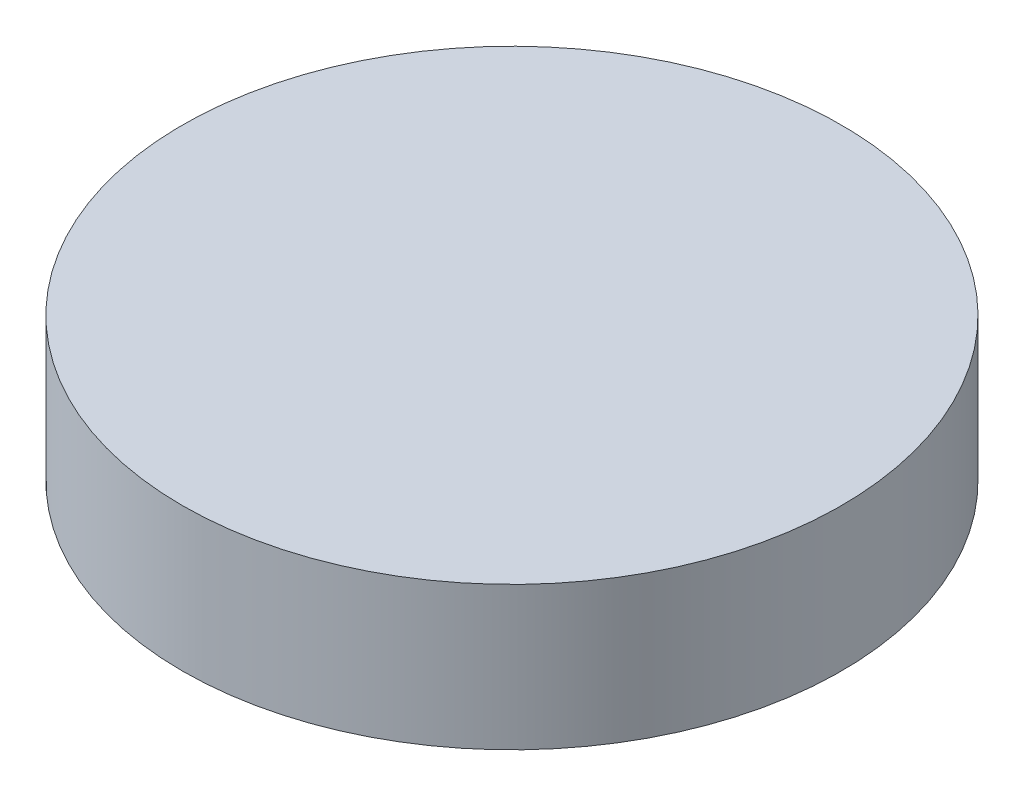
ISO-10303-21;
HEADER;
FILE_DESCRIPTION(('STEP AP214'),'2;1');
FILE_NAME('part.step','',(''),(''),'','','');
FILE_SCHEMA(('AUTOMOTIVE_DESIGN { 1 0 10303 214 1 1 1 1 }'));
ENDSEC;
DATA;
#1=APPLICATION_CONTEXT('core data for automotive mechanical design processes');
#2=APPLICATION_PROTOCOL_DEFINITION('international standard','automotive_design',2000,#1);
#3=PRODUCT_CONTEXT('',#1,'mechanical');
#4=PRODUCT('Part','Part','',(#3));
#5=PRODUCT_RELATED_PRODUCT_CATEGORY('part','',(#4));
#6=PRODUCT_DEFINITION_FORMATION('','',#4);
#7=PRODUCT_DEFINITION_CONTEXT('part definition',#1,'design');
#8=PRODUCT_DEFINITION('design','',#6,#7);
#9=PRODUCT_DEFINITION_SHAPE('','',#8);
#10=(LENGTH_UNIT() NAMED_UNIT(*) SI_UNIT(.MILLI.,.METRE.));
#11=(NAMED_UNIT(*) PLANE_ANGLE_UNIT() SI_UNIT($,.RADIAN.));
#12=(NAMED_UNIT(*) SI_UNIT($,.STERADIAN.) SOLID_ANGLE_UNIT());
#13=UNCERTAINTY_MEASURE_WITH_UNIT(LENGTH_MEASURE(1.E-05),#10,'distance_accuracy_value','');
#14=(GEOMETRIC_REPRESENTATION_CONTEXT(3) GLOBAL_UNCERTAINTY_ASSIGNED_CONTEXT((#13)) GLOBAL_UNIT_ASSIGNED_CONTEXT((#10,
#11,#12)) REPRESENTATION_CONTEXT('',''));
#15=CARTESIAN_POINT('',(0.,0.,0.));
#16=DIRECTION('',(0.,0.,1.));
#17=DIRECTION('',(1.,0.,0.));
#18=AXIS2_PLACEMENT_3D('',#15,#16,#17);
#19=CARTESIAN_POINT('',(-75.6640240711669,4.77524856096285,0.));
#20=DIRECTION('',(0.,1.,0.));
#21=DIRECTION('',(0.,0.,1.));
#22=AXIS2_PLACEMENT_3D('',#19,#20,#21);
#23=CYLINDRICAL_SURFACE('',#22,15.75);
#24=CARTESIAN_POINT('',(-75.6640240711669,3.27524856096285,0.));
#25=DIRECTION('',(0.,1.,0.));
#26=DIRECTION('',(0.,0.,1.));
#27=AXIS2_PLACEMENT_3D('',#24,#25,#26);
#28=CIRCLE('',#27,15.75);
#29=CARTESIAN_POINT('',(-75.6640240711669,3.27524856096285,15.75));
#30=VERTEX_POINT('',#29);
#31=EDGE_CURVE('E45',#30,#30,#28,.T.);
#32=ORIENTED_EDGE('',*,*,#31,.T.);
#33=EDGE_LOOP('',(#32));
#34=FACE_BOUND('',#33,.T.);
#35=CARTESIAN_POINT('',(-75.6640240711669,-2.72475143903715,0.));
#36=DIRECTION('',(0.,1.,0.));
#37=DIRECTION('',(0.,0.,1.));
#38=AXIS2_PLACEMENT_3D('',#35,#36,#37);
#39=CIRCLE('',#38,15.75);
#40=CARTESIAN_POINT('',(-75.6640240711669,-2.72475143903715,15.75));
#41=VERTEX_POINT('',#40);
#42=EDGE_CURVE('E10',#41,#41,#39,.T.);
#43=ORIENTED_EDGE('',*,*,#42,.F.);
#44=EDGE_LOOP('',(#43));
#45=FACE_BOUND('',#44,.T.);
#46=ADVANCED_FACE('F31',(#34,#45),#23,.F.);
#47=CARTESIAN_POINT('',(-91.4140240711669,-2.72475143903715,0.));
#48=DIRECTION('',(0.,-1.,0.));
#49=DIRECTION('',(0.,0.,-1.));
#50=AXIS2_PLACEMENT_3D('',#47,#48,#49);
#51=PLANE('',#50);
#52=ORIENTED_EDGE('',*,*,#42,.T.);
#53=EDGE_LOOP('',(#52));
#54=FACE_BOUND('',#53,.T.);
#55=CARTESIAN_POINT('',(-75.6640240711669,-2.72475143903715,0.));
#56=DIRECTION('',(0.,1.,0.));
#57=DIRECTION('',(0.,0.,1.));
#58=AXIS2_PLACEMENT_3D('',#55,#56,#57);
#59=CIRCLE('',#58,17.25);
#60=CARTESIAN_POINT('',(-75.6640240711669,-2.72475143903715,17.25));
#61=VERTEX_POINT('',#60);
#62=EDGE_CURVE('E37',#61,#61,#59,.T.);
#63=ORIENTED_EDGE('',*,*,#62,.F.);
#64=EDGE_LOOP('',(#63));
#65=FACE_BOUND('',#64,.T.);
#66=ADVANCED_FACE('F64',(#54,#65),#51,.T.);
#67=CARTESIAN_POINT('',(-75.6640240711669,4.77524856096285,0.));
#68=DIRECTION('',(0.,1.,0.));
#69=DIRECTION('',(0.,0.,1.));
#70=AXIS2_PLACEMENT_3D('',#67,#68,#69);
#71=CYLINDRICAL_SURFACE('',#70,17.25);
#72=ORIENTED_EDGE('',*,*,#62,.T.);
#73=EDGE_LOOP('',(#72));
#74=FACE_BOUND('',#73,.T.);
#75=CARTESIAN_POINT('',(-75.6640240711669,4.77524856096285,0.));
#76=DIRECTION('',(0.,1.,0.));
#77=DIRECTION('',(0.,0.,1.));
#78=AXIS2_PLACEMENT_3D('',#75,#76,#77);
#79=CIRCLE('',#78,17.25);
#80=CARTESIAN_POINT('',(-75.6640240711669,4.77524856096285,17.25));
#81=VERTEX_POINT('',#80);
#82=EDGE_CURVE('E41',#81,#81,#79,.T.);
#83=ORIENTED_EDGE('',*,*,#82,.F.);
#84=EDGE_LOOP('',(#83));
#85=FACE_BOUND('',#84,.T.);
#86=ADVANCED_FACE('F60',(#74,#85),#71,.T.);
#87=CARTESIAN_POINT('',(-92.9140240711669,4.77524856096285,0.));
#88=DIRECTION('',(0.,1.,0.));
#89=DIRECTION('',(0.,0.,1.));
#90=AXIS2_PLACEMENT_3D('',#87,#88,#89);
#91=PLANE('',#90);
#92=ORIENTED_EDGE('',*,*,#82,.T.);
#93=EDGE_LOOP('',(#92));
#94=FACE_BOUND('',#93,.T.);
#95=ADVANCED_FACE('F55',(#94),#91,.T.);
#96=CARTESIAN_POINT('',(-75.6640240711669,3.27524856096285,0.));
#97=DIRECTION('',(0.,-1.,0.));
#98=DIRECTION('',(0.,0.,-1.));
#99=AXIS2_PLACEMENT_3D('',#96,#97,#98);
#100=PLANE('',#99);
#101=ORIENTED_EDGE('',*,*,#31,.F.);
#102=EDGE_LOOP('',(#101));
#103=FACE_BOUND('',#102,.T.);
#104=ADVANCED_FACE('F53',(#103),#100,.T.);
#105=CLOSED_SHELL('',(#46,#66,#86,#95,#104));
#106=MANIFOLD_SOLID_BREP('B2',#105);
#107=ADVANCED_BREP_SHAPE_REPRESENTATION('',(#18,#106),#14);
#108=SHAPE_DEFINITION_REPRESENTATION(#9,#107);
ENDSEC;
END-ISO-10303-21;
